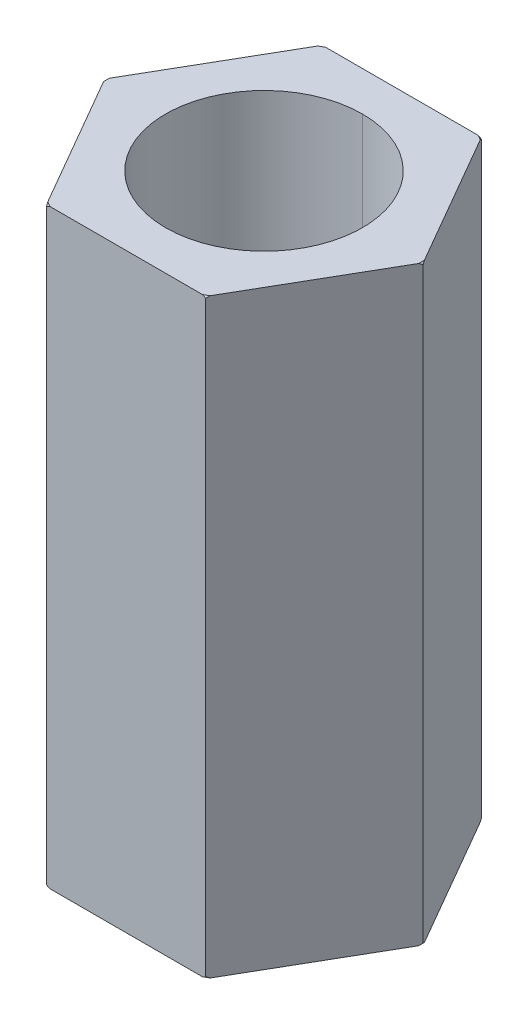
ISO-10303-21;
HEADER;
FILE_DESCRIPTION(('STEP AP214'),'2;1');
FILE_NAME('part.step','',(''),(''),'','','');
FILE_SCHEMA(('AUTOMOTIVE_DESIGN { 1 0 10303 214 1 1 1 1 }'));
ENDSEC;
DATA;
#1=APPLICATION_CONTEXT('core data for automotive mechanical design processes');
#2=APPLICATION_PROTOCOL_DEFINITION('international standard','automotive_design',2000,#1);
#3=PRODUCT_CONTEXT('',#1,'mechanical');
#4=PRODUCT('Part','Part','',(#3));
#5=PRODUCT_RELATED_PRODUCT_CATEGORY('part','',(#4));
#6=PRODUCT_DEFINITION_FORMATION('','',#4);
#7=PRODUCT_DEFINITION_CONTEXT('part definition',#1,'design');
#8=PRODUCT_DEFINITION('design','',#6,#7);
#9=PRODUCT_DEFINITION_SHAPE('','',#8);
#10=(LENGTH_UNIT() NAMED_UNIT(*) SI_UNIT(.MILLI.,.METRE.));
#11=(NAMED_UNIT(*) PLANE_ANGLE_UNIT() SI_UNIT($,.RADIAN.));
#12=(NAMED_UNIT(*) SI_UNIT($,.STERADIAN.) SOLID_ANGLE_UNIT());
#13=UNCERTAINTY_MEASURE_WITH_UNIT(LENGTH_MEASURE(1.E-05),#10,'distance_accuracy_value','');
#14=(GEOMETRIC_REPRESENTATION_CONTEXT(3) GLOBAL_UNCERTAINTY_ASSIGNED_CONTEXT((#13)) GLOBAL_UNIT_ASSIGNED_CONTEXT((#10,
#11,#12)) REPRESENTATION_CONTEXT('',''));
#15=CARTESIAN_POINT('',(0.,0.,0.));
#16=DIRECTION('',(0.,0.,1.));
#17=DIRECTION('',(1.,0.,0.));
#18=AXIS2_PLACEMENT_3D('',#15,#16,#17);
#19=CARTESIAN_POINT('',(-154.451169057511,-7.90000000007917,3.18934404187436E-08));
#20=DIRECTION('',(0.866025407723111,0.,-0.499999993178019));
#21=DIRECTION('',(0.,-1.,0.));
#22=AXIS2_PLACEMENT_3D('',#19,#20,#21);
#23=PLANE('',#22);
#24=DIRECTION('',(-0.499999993178019,0.,-0.866025407723111));
#25=VECTOR('',#24,1.);
#26=CARTESIAN_POINT('',(-154.451169057511,-7.90000000007917,3.18934404187436E-08));
#27=LINE('',#26,#25);
#28=CARTESIAN_POINT('',(-154.493286191451,-7.9000000000633,-0.0729489852858785));
#29=VERTEX_POINT('',#28);
#30=CARTESIAN_POINT('',(-156.429777838165,-7.90000000007917,-3.42705096684511));
#31=VERTEX_POINT('',#30);
#32=EDGE_CURVE('E537',#29,#31,#27,.T.);
#33=ORIENTED_EDGE('',*,*,#32,.T.);
#34=CARTESIAN_POINT('',(-156.471894972104,-7.85854811574754,-3.49999998402448));
#35=CARTESIAN_POINT('',(-156.457884963536,-7.8725581245091,-3.4757339369268));
#36=CARTESIAN_POINT('',(-156.443846342278,-7.88637822934221,-3.45141833119845));
#37=CARTESIAN_POINT('',(-156.429777838165,-7.90000000007917,-3.42705096684511));
#38=(BOUNDED_CURVE() B_SPLINE_CURVE(3,(#34,#35,#36,#37),.UNSPECIFIED.,.F.,
.F.) B_SPLINE_CURVE_WITH_KNOTS((4,4),(8.90538928710057E-07,9.35024040561138E-05),
.UNSPECIFIED.) CURVE() GEOMETRIC_REPRESENTATION_ITEM() RATIONAL_B_SPLINE_CURVE((1.,1.,1.,1.)) REPRESENTATION_ITEM(''));
#39=CARTESIAN_POINT('',(-156.471894972104,-7.85854811574754,-3.49999998402448));
#40=VERTEX_POINT('',#39);
#41=EDGE_CURVE('E341',#40,#31,#38,.T.);
#42=ORIENTED_EDGE('',*,*,#41,.F.);
#43=DIRECTION('',(0.,1.,0.));
#44=VECTOR('',#43,1.);
#45=CARTESIAN_POINT('',(-156.471894972104,-7.90000000007917,-3.49999998402448));
#46=LINE('',#45,#44);
#47=CARTESIAN_POINT('',(-156.471894972104,7.05854811567171,-3.49999998402447));
#48=VERTEX_POINT('',#47);
#49=EDGE_CURVE('E10',#40,#48,#46,.T.);
#50=ORIENTED_EDGE('',*,*,#49,.T.);
#51=CARTESIAN_POINT('',(-156.429777838165,7.0999999999799,-3.4270509668451));
#52=CARTESIAN_POINT('',(-156.443856137951,7.08636874464178,-3.45143529780168));
#53=CARTESIAN_POINT('',(-156.457894565006,7.07254852296098,-3.47575056716213));
#54=CARTESIAN_POINT('',(-156.471894972104,7.05854811567171,-3.49999998402447));
#55=(BOUNDED_CURVE() B_SPLINE_CURVE(3,(#51,#52,#53,#54),.UNSPECIFIED.,.F.,
.F.) B_SPLINE_CURVE_WITH_KNOTS((4,4),(0.00200542437731116,0.00209830438009965),
.UNSPECIFIED.) CURVE() GEOMETRIC_REPRESENTATION_ITEM() RATIONAL_B_SPLINE_CURVE((1.,1.,1.,1.)) REPRESENTATION_ITEM(''));
#56=CARTESIAN_POINT('',(-156.429777838165,7.0999999999799,-3.4270509668451));
#57=VERTEX_POINT('',#56);
#58=EDGE_CURVE('E395',#57,#48,#55,.T.);
#59=ORIENTED_EDGE('',*,*,#58,.F.);
#60=DIRECTION('',(-0.499999993178019,0.,-0.866025407723111));
#61=VECTOR('',#60,1.);
#62=CARTESIAN_POINT('',(-155.461532014808,7.10000000000034,-1.74999997606549));
#63=LINE('',#62,#61);
#64=CARTESIAN_POINT('',(-154.493286191451,7.10000000000034,-0.0729489852858814));
#65=VERTEX_POINT('',#64);
#66=EDGE_CURVE('E47',#65,#57,#63,.T.);
#67=ORIENTED_EDGE('',*,*,#66,.F.);
#68=CARTESIAN_POINT('',(-154.451169057511,7.05854811567173,3.1893443186631E-08));
#69=CARTESIAN_POINT('',(-154.465179066081,7.07255812443095,-0.0242660152045795));
#70=CARTESIAN_POINT('',(-154.479217687338,7.08637822926172,-0.0485816209332638));
#71=CARTESIAN_POINT('',(-154.493286191451,7.10000000000034,-0.0729489852858814));
#72=(BOUNDED_CURVE() B_SPLINE_CURVE(3,(#68,#69,#70,#71),.UNSPECIFIED.,.F.,
.F.) B_SPLINE_CURVE_WITH_KNOTS((4,4),(8.90538928679352E-07,9.35024040539287E-05),
.UNSPECIFIED.) CURVE() GEOMETRIC_REPRESENTATION_ITEM() RATIONAL_B_SPLINE_CURVE((1.,1.,1.,1.)) REPRESENTATION_ITEM(''));
#73=CARTESIAN_POINT('',(-154.451169057511,7.05854811567173,3.1893443186631E-08));
#74=VERTEX_POINT('',#73);
#75=EDGE_CURVE('E504',#74,#65,#72,.T.);
#76=ORIENTED_EDGE('',*,*,#75,.F.);
#77=DIRECTION('',(0.,1.,0.));
#78=VECTOR('',#77,1.);
#79=CARTESIAN_POINT('',(-154.451169057511,-7.90000000007917,3.18934404187436E-08));
#80=LINE('',#79,#78);
#81=CARTESIAN_POINT('',(-154.451169057511,-7.85854811574756,3.18934404264137E-08));
#82=VERTEX_POINT('',#81);
#83=EDGE_CURVE('E37',#82,#74,#80,.T.);
#84=ORIENTED_EDGE('',*,*,#83,.F.);
#85=CARTESIAN_POINT('',(-154.493286191451,-7.9000000000633,-0.0729489852858785));
#86=CARTESIAN_POINT('',(-154.479210408788,-7.88637118191619,-0.0485690141136089));
#87=CARTESIAN_POINT('',(-154.465171929299,-7.8725509877266,-0.0242536539342294));
#88=CARTESIAN_POINT('',(-154.451169057511,-7.85854811574756,3.18934404264137E-08));
#89=(BOUNDED_CURVE() B_SPLINE_CURVE(3,(#85,#86,#87,#88),.UNSPECIFIED.,.F.,
.F.) B_SPLINE_CURVE_WITH_KNOTS((4,4),(0.00206716359408731,0.00216043693066559),
.UNSPECIFIED.) CURVE() GEOMETRIC_REPRESENTATION_ITEM() RATIONAL_B_SPLINE_CURVE((1.,1.,1.,1.)) REPRESENTATION_ITEM(''));
#90=EDGE_CURVE('E351',#29,#82,#89,.T.);
#91=ORIENTED_EDGE('',*,*,#90,.F.);
#92=EDGE_LOOP('',(#33,#42,#50,#59,#67,#76,#84,#91));
#93=FACE_BOUND('',#92,.T.);
#94=ADVANCED_FACE('F16',(#93),#23,.T.);
#95=CARTESIAN_POINT('',(-156.471894972104,-7.90000000007917,-3.49999998402448));
#96=DIRECTION('',(7.87733906095199E-09,0.,-1.));
#97=DIRECTION('',(0.,-1.,0.));
#98=AXIS2_PLACEMENT_3D('',#95,#96,#97);
#99=PLANE('',#98);
#100=DIRECTION('',(0.,1.,0.));
#101=VECTOR('',#100,1.);
#102=CARTESIAN_POINT('',(-160.513346856432,-7.90000000007917,-3.50000001586036));
#103=LINE('',#102,#101);
#104=CARTESIAN_POINT('',(-160.513346856432,-7.85854811574755,-3.50000001586036));
#105=VERTEX_POINT('',#104);
#106=CARTESIAN_POINT('',(-160.513346856432,7.05854811567171,-3.50000001586036));
#107=VERTEX_POINT('',#106);
#108=EDGE_CURVE('E24',#105,#107,#103,.T.);
#109=ORIENTED_EDGE('',*,*,#108,.T.);
#110=CARTESIAN_POINT('',(-160.429112587404,7.10000000000034,-3.50000001519682));
#111=CARTESIAN_POINT('',(-160.457269187895,7.08636874438265,-3.50000001541862));
#112=CARTESIAN_POINT('',(-160.485346042379,7.07254852269762,-3.50000001563979));
#113=CARTESIAN_POINT('',(-160.513346856432,7.05854811567171,-3.50000001586036));
#114=(BOUNDED_CURVE() B_SPLINE_CURVE(3,(#110,#111,#112,#113),.UNSPECIFIED.,.F.,
.F.) B_SPLINE_CURVE_WITH_KNOTS((4,4),(0.00200531664897424,0.00209819653849958),
.UNSPECIFIED.) CURVE() GEOMETRIC_REPRESENTATION_ITEM() RATIONAL_B_SPLINE_CURVE((1.,1.,1.,1.)) REPRESENTATION_ITEM(''));
#115=CARTESIAN_POINT('',(-160.429112587404,7.10000000000034,-3.50000001519682));
#116=VERTEX_POINT('',#115);
#117=EDGE_CURVE('E352',#116,#107,#114,.T.);
#118=ORIENTED_EDGE('',*,*,#117,.F.);
#119=DIRECTION('',(-1.,0.,-7.87733906095199E-09));
#120=VECTOR('',#119,1.);
#121=CARTESIAN_POINT('',(-158.492620914268,7.10000000000034,-3.49999999994241));
#122=LINE('',#121,#120);
#123=CARTESIAN_POINT('',(-156.556129241133,7.10000000000034,-3.49999998468801));
#124=VERTEX_POINT('',#123);
#125=EDGE_CURVE('E481',#124,#116,#122,.T.);
#126=ORIENTED_EDGE('',*,*,#125,.F.);
#127=CARTESIAN_POINT('',(-156.471894972104,7.05854811567171,-3.49999998402447));
#128=CARTESIAN_POINT('',(-156.499914992089,7.07255812566235,-3.49999998424519));
#129=CARTESIAN_POINT('',(-156.527992235033,7.08637823047646,-3.49999998446637));
#130=CARTESIAN_POINT('',(-156.556129241133,7.10000000000034,-3.49999998468801));
#131=(BOUNDED_CURVE() B_SPLINE_CURVE(3,(#127,#128,#129,#130),.UNSPECIFIED.,.F.,
.F.) B_SPLINE_CURVE_WITH_KNOTS((4,4),(7.71225514155726E-07,9.33828832193013E-05),
.UNSPECIFIED.) CURVE() GEOMETRIC_REPRESENTATION_ITEM() RATIONAL_B_SPLINE_CURVE((1.,1.,1.,1.)) REPRESENTATION_ITEM(''));
#132=EDGE_CURVE('E404',#48,#124,#131,.T.);
#133=ORIENTED_EDGE('',*,*,#132,.F.);
#134=ORIENTED_EDGE('',*,*,#49,.F.);
#135=CARTESIAN_POINT('',(-156.556129241133,-7.90000000007917,-3.49999998468802));
#136=CARTESIAN_POINT('',(-156.527972640642,-7.88636874446331,-3.49999998446622));
#137=CARTESIAN_POINT('',(-156.499895786158,-7.87254852277602,-3.49999998424504));
#138=CARTESIAN_POINT('',(-156.471894972104,-7.85854811574754,-3.49999998402448));
#139=(BOUNDED_CURVE() B_SPLINE_CURVE(3,(#135,#136,#137,#138),.UNSPECIFIED.,.F.,
.F.) B_SPLINE_CURVE_WITH_KNOTS((4,4),(0.00200531667631435,0.00209819656584083),
.UNSPECIFIED.) CURVE() GEOMETRIC_REPRESENTATION_ITEM() RATIONAL_B_SPLINE_CURVE((1.,1.,1.,1.)) REPRESENTATION_ITEM(''));
#140=CARTESIAN_POINT('',(-156.556129241133,-7.90000000007917,-3.49999998468802));
#141=VERTEX_POINT('',#140);
#142=EDGE_CURVE('E332',#141,#40,#139,.T.);
#143=ORIENTED_EDGE('',*,*,#142,.F.);
#144=DIRECTION('',(-1.,0.,-7.87733906095199E-09));
#145=VECTOR('',#144,1.);
#146=CARTESIAN_POINT('',(-156.471894972104,-7.90000000007917,-3.49999998402448));
#147=LINE('',#146,#145);
#148=CARTESIAN_POINT('',(-160.429112587404,-7.90000000007918,-3.50000001519682));
#149=VERTEX_POINT('',#148);
#150=EDGE_CURVE('E531',#141,#149,#147,.T.);
#151=ORIENTED_EDGE('',*,*,#150,.T.);
#152=CARTESIAN_POINT('',(-160.513346856432,-7.85854811574755,-3.50000001586036));
#153=CARTESIAN_POINT('',(-160.485326836449,-7.87255812574054,-3.50000001563963));
#154=CARTESIAN_POINT('',(-160.457249593505,-7.88637823055697,-3.50000001541847));
#155=CARTESIAN_POINT('',(-160.429112587404,-7.90000000007918,-3.50000001519682));
#156=(BOUNDED_CURVE() B_SPLINE_CURVE(3,(#152,#153,#154,#155),.UNSPECIFIED.,.F.,
.F.) B_SPLINE_CURVE_WITH_KNOTS((4,4),(7.71225514202071E-07,9.33828832214226E-05),
.UNSPECIFIED.) CURVE() GEOMETRIC_REPRESENTATION_ITEM() RATIONAL_B_SPLINE_CURVE((1.,1.,1.,1.)) REPRESENTATION_ITEM(''));
#157=EDGE_CURVE('E302',#105,#149,#156,.T.);
#158=ORIENTED_EDGE('',*,*,#157,.F.);
#159=EDGE_LOOP('',(#109,#118,#126,#133,#134,#143,#151,#158));
#160=FACE_BOUND('',#159,.T.);
#161=ADVANCED_FACE('F561',(#160),#99,.T.);
#162=CARTESIAN_POINT('',(-160.513346856432,-7.90000000007917,-3.50000001586036));
#163=DIRECTION('',(-0.866025399845771,0.,-0.500000006821972));
#164=DIRECTION('',(-0.500000006821972,0.,0.866025399845771));
#165=AXIS2_PLACEMENT_3D('',#162,#163,#164);
#166=PLANE('',#165);
#167=DIRECTION('',(-0.500000006821972,0.,0.866025399845771));
#168=VECTOR('',#167,1.);
#169=CARTESIAN_POINT('',(-160.513346856432,-7.90000000007917,-3.50000001586036));
#170=LINE('',#169,#168);
#171=CARTESIAN_POINT('',(-160.555463991521,-7.90000000007917,-3.42705099934455));
#172=VERTEX_POINT('',#171);
#173=CARTESIAN_POINT('',(-162.491955691085,-7.90000000007918,-0.0729490482809071));
#174=VERTEX_POINT('',#173);
#175=EDGE_CURVE('E524',#172,#174,#170,.T.);
#176=ORIENTED_EDGE('',*,*,#175,.T.);
#177=CARTESIAN_POINT('',(-162.534072826167,-7.8585481156981,-3.17783206154693E-08));
#178=CARTESIAN_POINT('',(-162.520062817215,-7.87255812445961,-0.0242660786551696));
#179=CARTESIAN_POINT('',(-162.506024195574,-7.88637822929266,-0.0485816841622434));
#180=CARTESIAN_POINT('',(-162.491955691085,-7.90000000007918,-0.0729490482809071));
#181=(BOUNDED_CURVE() B_SPLINE_CURVE(3,(#177,#178,#179,#180),.UNSPECIFIED.,.F.,
.F.) B_SPLINE_CURVE_WITH_KNOTS((4,4),(8.90538936818046E-07,9.35024040638618E-05),
.UNSPECIFIED.) CURVE() GEOMETRIC_REPRESENTATION_ITEM() RATIONAL_B_SPLINE_CURVE((1.,1.,1.,1.)) REPRESENTATION_ITEM(''));
#182=CARTESIAN_POINT('',(-162.534072826167,-7.8585481156981,-3.17783206154693E-08));
#183=VERTEX_POINT('',#182);
#184=EDGE_CURVE('E259',#183,#174,#181,.T.);
#185=ORIENTED_EDGE('',*,*,#184,.F.);
#186=DIRECTION('',(0.,1.,0.));
#187=VECTOR('',#186,1.);
#188=CARTESIAN_POINT('',(-162.534072826167,-7.90000000007918,-3.17783206231394E-08));
#189=LINE('',#188,#187);
#190=CARTESIAN_POINT('',(-162.534072826167,7.05854811578901,-3.17783178552521E-08));
#191=VERTEX_POINT('',#190);
#192=EDGE_CURVE('E488',#183,#191,#189,.T.);
#193=ORIENTED_EDGE('',*,*,#192,.T.);
#194=CARTESIAN_POINT('',(-162.491955691085,7.10000000000034,-0.0729490482809145));
#195=CARTESIAN_POINT('',(-162.506031474141,7.08637118193963,-0.0485690773163528));
#196=CARTESIAN_POINT('',(-162.520069954005,7.07255098775869,-0.0242537173713759));
#197=CARTESIAN_POINT('',(-162.534072826167,7.05854811578901,-3.17783178552521E-08));
#198=(BOUNDED_CURVE() B_SPLINE_CURVE(3,(#194,#195,#196,#197),.UNSPECIFIED.,.F.,
.F.) B_SPLINE_CURVE_WITH_KNOTS((4,4),(0.00206716353747514,0.0021604368739946),
.UNSPECIFIED.) CURVE() GEOMETRIC_REPRESENTATION_ITEM() RATIONAL_B_SPLINE_CURVE((1.,1.,1.,1.)) REPRESENTATION_ITEM(''));
#199=CARTESIAN_POINT('',(-162.491955691085,7.10000000000034,-0.0729490482809145));
#200=VERTEX_POINT('',#199);
#201=EDGE_CURVE('E442',#200,#191,#198,.T.);
#202=ORIENTED_EDGE('',*,*,#201,.F.);
#203=DIRECTION('',(-0.500000006821972,0.,0.866025399845771));
#204=VECTOR('',#203,1.);
#205=CARTESIAN_POINT('',(-161.523709841299,7.10000000000034,-1.75000002381933));
#206=LINE('',#205,#204);
#207=CARTESIAN_POINT('',(-160.555463991521,7.10000000000034,-3.42705099934456));
#208=VERTEX_POINT('',#207);
#209=EDGE_CURVE('E528',#208,#200,#206,.T.);
#210=ORIENTED_EDGE('',*,*,#209,.F.);
#211=CARTESIAN_POINT('',(-160.513346856432,7.05854811567171,-3.50000001586036));
#212=CARTESIAN_POINT('',(-160.527356865383,7.07255812443093,-3.47573396898305));
#213=CARTESIAN_POINT('',(-160.541395487025,7.08637822926169,-3.45141836347554));
#214=CARTESIAN_POINT('',(-160.555463991521,7.10000000000034,-3.42705099934456));
#215=(BOUNDED_CURVE() B_SPLINE_CURVE(3,(#211,#212,#213,#214),.UNSPECIFIED.,.F.,
.F.) B_SPLINE_CURVE_WITH_KNOTS((4,4),(8.90538936789053E-07,9.35024040620685E-05),
.UNSPECIFIED.) CURVE() GEOMETRIC_REPRESENTATION_ITEM() RATIONAL_B_SPLINE_CURVE((1.,1.,1.,1.)) REPRESENTATION_ITEM(''));
#216=EDGE_CURVE('E361',#107,#208,#215,.T.);
#217=ORIENTED_EDGE('',*,*,#216,.F.);
#218=ORIENTED_EDGE('',*,*,#108,.F.);
#219=CARTESIAN_POINT('',(-160.555463991521,-7.90000000007917,-3.42705099934455));
#220=CARTESIAN_POINT('',(-160.541385691353,-7.8863687447245,-3.45143533007615));
#221=CARTESIAN_POINT('',(-160.527347263914,-7.87254852304028,-3.47575059921702));
#222=CARTESIAN_POINT('',(-160.513346856432,-7.85854811574755,-3.50000001586036));
#223=(BOUNDED_CURVE() B_SPLINE_CURVE(3,(#219,#220,#221,#222),.UNSPECIFIED.,.F.,
.F.) B_SPLINE_CURVE_WITH_KNOTS((4,4),(0.00200542437733993,0.00209830438013784),
.UNSPECIFIED.) CURVE() GEOMETRIC_REPRESENTATION_ITEM() RATIONAL_B_SPLINE_CURVE((1.,1.,1.,1.)) REPRESENTATION_ITEM(''));
#224=EDGE_CURVE('E292',#172,#105,#223,.T.);
#225=ORIENTED_EDGE('',*,*,#224,.F.);
#226=EDGE_LOOP('',(#176,#185,#193,#202,#210,#217,#218,#225));
#227=FACE_BOUND('',#226,.T.);
#228=ADVANCED_FACE('F564',(#227),#166,.T.);
#229=CARTESIAN_POINT('',(-162.534072826167,-7.90000000007918,-3.17783206231394E-08));
#230=DIRECTION('',(-0.866025407723108,0.,0.499999993178024));
#231=DIRECTION('',(0.,1.,0.));
#232=AXIS2_PLACEMENT_3D('',#229,#230,#231);
#233=PLANE('',#232);
#234=DIRECTION('',(0.499999993178024,0.,0.866025407723108));
#235=VECTOR('',#234,1.);
#236=CARTESIAN_POINT('',(-162.534072826167,-7.90000000007918,-3.17783206231394E-08));
#237=LINE('',#236,#235);
#238=CARTESIAN_POINT('',(-162.491955692234,-7.90000000007918,0.0729489853877965));
#239=VERTEX_POINT('',#238);
#240=CARTESIAN_POINT('',(-160.555464045513,-7.90000000007918,3.4270509669603));
#241=VERTEX_POINT('',#240);
#242=EDGE_CURVE('E521',#239,#241,#237,.T.);
#243=ORIENTED_EDGE('',*,*,#242,.T.);
#244=CARTESIAN_POINT('',(-160.513346911573,-7.85854811574756,3.49999998413964));
#245=CARTESIAN_POINT('',(-160.527356920142,-7.87255812450913,3.47573393704198));
#246=CARTESIAN_POINT('',(-160.5413955414,-7.88637822934222,3.45141833131363));
#247=CARTESIAN_POINT('',(-160.555464045513,-7.90000000007918,3.4270509669603));
#248=(BOUNDED_CURVE() B_SPLINE_CURVE(3,(#244,#245,#246,#247),.UNSPECIFIED.,.F.,
.F.) B_SPLINE_CURVE_WITH_KNOTS((4,4),(8.90538928711855E-07,9.35024040560965E-05),
.UNSPECIFIED.) CURVE() GEOMETRIC_REPRESENTATION_ITEM() RATIONAL_B_SPLINE_CURVE((1.,1.,1.,1.)) REPRESENTATION_ITEM(''));
#249=CARTESIAN_POINT('',(-160.513346911573,-7.85854811574756,3.49999998413964));
#250=VERTEX_POINT('',#249);
#251=EDGE_CURVE('E244',#250,#241,#248,.T.);
#252=ORIENTED_EDGE('',*,*,#251,.F.);
#253=DIRECTION('',(0.,1.,0.));
#254=VECTOR('',#253,1.);
#255=CARTESIAN_POINT('',(-160.513346911573,-7.90000000007918,3.49999998413964));
#256=LINE('',#255,#254);
#257=CARTESIAN_POINT('',(-160.513346911573,7.05854811567172,3.49999998413964));
#258=VERTEX_POINT('',#257);
#259=EDGE_CURVE('E494',#250,#258,#256,.T.);
#260=ORIENTED_EDGE('',*,*,#259,.T.);
#261=CARTESIAN_POINT('',(-160.555464045513,7.10000000000034,3.42705096696027));
#262=CARTESIAN_POINT('',(-160.54138574573,7.08636874464412,3.45143529791273));
#263=CARTESIAN_POINT('',(-160.527347318673,7.07254852296218,3.47575056727524));
#264=CARTESIAN_POINT('',(-160.513346911573,7.05854811567172,3.49999998413964));
#265=(BOUNDED_CURVE() B_SPLINE_CURVE(3,(#261,#262,#263,#264),.UNSPECIFIED.,.F.,
.F.) B_SPLINE_CURVE_WITH_KNOTS((4,4),(0.0020054243773033,0.00209830438009966),
.UNSPECIFIED.) CURVE() GEOMETRIC_REPRESENTATION_ITEM() RATIONAL_B_SPLINE_CURVE((1.,1.,1.,1.)) REPRESENTATION_ITEM(''));
#266=CARTESIAN_POINT('',(-160.555464045513,7.10000000000034,3.42705096696027));
#267=VERTEX_POINT('',#266);
#268=EDGE_CURVE('E428',#267,#258,#265,.T.);
#269=ORIENTED_EDGE('',*,*,#268,.F.);
#270=DIRECTION('',(0.499999993178024,0.,0.866025407723108));
#271=VECTOR('',#270,1.);
#272=CARTESIAN_POINT('',(-161.52370986887,7.10000000000034,1.74999997618065));
#273=LINE('',#272,#271);
#274=CARTESIAN_POINT('',(-162.491955692234,7.10000000000034,0.0729489853878461));
#275=VERTEX_POINT('',#274);
#276=EDGE_CURVE('E525',#275,#267,#273,.T.);
#277=ORIENTED_EDGE('',*,*,#276,.F.);
#278=CARTESIAN_POINT('',(-162.534072826167,7.05854811578901,-3.17783178552521E-08));
#279=CARTESIAN_POINT('',(-162.520062817604,7.07255812454202,0.0242660153067459));
#280=CARTESIAN_POINT('',(-162.506024196355,7.08637822936676,0.0485816210224043));
#281=CARTESIAN_POINT('',(-162.491955692234,7.10000000000034,0.0729489853878461));
#282=(BOUNDED_CURVE() B_SPLINE_CURVE(3,(#278,#279,#280,#281),.UNSPECIFIED.,.F.,
.F.) B_SPLINE_CURVE_WITH_KNOTS((4,4),(8.90538928726498E-07,9.35024040062036E-05),
.UNSPECIFIED.) CURVE() GEOMETRIC_REPRESENTATION_ITEM() RATIONAL_B_SPLINE_CURVE((1.,1.,1.,1.)) REPRESENTATION_ITEM(''));
#283=EDGE_CURVE('E429',#191,#275,#282,.T.);
#284=ORIENTED_EDGE('',*,*,#283,.F.);
#285=ORIENTED_EDGE('',*,*,#192,.F.);
#286=CARTESIAN_POINT('',(-162.491955692234,-7.90000000007918,0.0729489853877965));
#287=CARTESIAN_POINT('',(-162.506031474887,-7.8863711818698,0.0485690142341432));
#288=CARTESIAN_POINT('',(-162.520069954378,-7.87255098767883,0.0242536540522693));
#289=CARTESIAN_POINT('',(-162.534072826167,-7.8585481156981,-3.17783206154693E-08));
#290=(BOUNDED_CURVE() B_SPLINE_CURVE(3,(#286,#287,#288,#289),.UNSPECIFIED.,.F.,
.F.) B_SPLINE_CURVE_WITH_KNOTS((4,4),(0.00206716362406268,0.00216043696065402),
.UNSPECIFIED.) CURVE() GEOMETRIC_REPRESENTATION_ITEM() RATIONAL_B_SPLINE_CURVE((1.,1.,1.,1.)) REPRESENTATION_ITEM(''));
#291=EDGE_CURVE('E254',#239,#183,#290,.T.);
#292=ORIENTED_EDGE('',*,*,#291,.F.);
#293=EDGE_LOOP('',(#243,#252,#260,#269,#277,#284,#285,#292));
#294=FACE_BOUND('',#293,.T.);
#295=ADVANCED_FACE('F595',(#294),#233,.T.);
#296=CARTESIAN_POINT('',(-160.513346911573,-7.90000000007918,3.49999998413964));
#297=DIRECTION('',(-7.8773391682604E-09,0.,1.));
#298=DIRECTION('',(-2.34898067185813E-08,1.,0.));
#299=AXIS2_PLACEMENT_3D('',#296,#297,#298);
#300=PLANE('',#299);
#301=DIRECTION('',(1.,0.,7.87733916826039E-09));
#302=VECTOR('',#301,1.);
#303=CARTESIAN_POINT('',(-160.513346911573,-7.90000000007918,3.49999998413964));
#304=LINE('',#303,#302);
#305=CARTESIAN_POINT('',(-160.429112642545,-7.90000000007918,3.49999998480318));
#306=VERTEX_POINT('',#305);
#307=CARTESIAN_POINT('',(-156.556129296274,-7.90000000007918,3.50000001531199));
#308=VERTEX_POINT('',#307);
#309=EDGE_CURVE('E518',#306,#308,#304,.T.);
#310=ORIENTED_EDGE('',*,*,#309,.T.);
#311=CARTESIAN_POINT('',(-156.471895027246,-7.85854811574757,3.50000001597553));
#312=CARTESIAN_POINT('',(-156.499915047229,-7.87255812574055,3.50000001575481));
#313=CARTESIAN_POINT('',(-156.527992290174,-7.88637823055697,3.50000001553363));
#314=CARTESIAN_POINT('',(-156.556129296274,-7.90000000007918,3.50000001531199));
#315=(BOUNDED_CURVE() B_SPLINE_CURVE(3,(#311,#312,#313,#314),.UNSPECIFIED.,.F.,
.F.) B_SPLINE_CURVE_WITH_KNOTS((4,4),(7.71225514202071E-07,9.33828832213644E-05),
.UNSPECIFIED.) CURVE() GEOMETRIC_REPRESENTATION_ITEM() RATIONAL_B_SPLINE_CURVE((1.,1.,1.,1.)) REPRESENTATION_ITEM(''));
#316=CARTESIAN_POINT('',(-156.471895027246,-7.85854811574757,3.50000001597553));
#317=VERTEX_POINT('',#316);
#318=EDGE_CURVE('E331',#317,#308,#315,.T.);
#319=ORIENTED_EDGE('',*,*,#318,.F.);
#320=DIRECTION('',(0.,1.,0.));
#321=VECTOR('',#320,1.);
#322=CARTESIAN_POINT('',(-156.471895027246,-7.90000000007917,3.50000001597553));
#323=LINE('',#322,#321);
#324=CARTESIAN_POINT('',(-156.471895027246,7.05854811567173,3.50000001597553));
#325=VERTEX_POINT('',#324);
#326=EDGE_CURVE('E534',#317,#325,#323,.T.);
#327=ORIENTED_EDGE('',*,*,#326,.T.);
#328=CARTESIAN_POINT('',(-156.556129296274,7.10000000000034,3.50000001531199));
#329=CARTESIAN_POINT('',(-156.527972695783,7.08636874438266,3.50000001553379));
#330=CARTESIAN_POINT('',(-156.499895841299,7.07254852269763,3.50000001575496));
#331=CARTESIAN_POINT('',(-156.471895027246,7.05854811567173,3.50000001597553));
#332=(BOUNDED_CURVE() B_SPLINE_CURVE(3,(#328,#329,#330,#331),.UNSPECIFIED.,.F.,
.F.) B_SPLINE_CURVE_WITH_KNOTS((4,4),(0.00200531664897421,0.00209819653849952),
.UNSPECIFIED.) CURVE() GEOMETRIC_REPRESENTATION_ITEM() RATIONAL_B_SPLINE_CURVE((1.,1.,1.,1.)) REPRESENTATION_ITEM(''));
#333=CARTESIAN_POINT('',(-156.556129296274,7.10000000000034,3.50000001531199));
#334=VERTEX_POINT('',#333);
#335=EDGE_CURVE('E275',#334,#325,#332,.T.);
#336=ORIENTED_EDGE('',*,*,#335,.F.);
#337=DIRECTION('',(1.,0.,7.87733916826039E-09));
#338=VECTOR('',#337,1.);
#339=CARTESIAN_POINT('',(-158.49262096941,7.10000000000034,3.50000000005759));
#340=LINE('',#339,#338);
#341=CARTESIAN_POINT('',(-160.429112642545,7.10000000000034,3.49999998480319));
#342=VERTEX_POINT('',#341);
#343=EDGE_CURVE('E217',#342,#334,#340,.T.);
#344=ORIENTED_EDGE('',*,*,#343,.F.);
#345=CARTESIAN_POINT('',(-160.513346911573,7.05854811567172,3.49999998413964));
#346=CARTESIAN_POINT('',(-160.485326891589,7.07255812566235,3.49999998436037));
#347=CARTESIAN_POINT('',(-160.457249648645,7.08637823047645,3.49999998458154));
#348=CARTESIAN_POINT('',(-160.429112642545,7.10000000000034,3.49999998480319));
#349=(BOUNDED_CURVE() B_SPLINE_CURVE(3,(#345,#346,#347,#348),.UNSPECIFIED.,.F.,
.F.) B_SPLINE_CURVE_WITH_KNOTS((4,4),(7.71225514155726E-07,9.33828832192431E-05),
.UNSPECIFIED.) CURVE() GEOMETRIC_REPRESENTATION_ITEM() RATIONAL_B_SPLINE_CURVE((1.,1.,1.,1.)) REPRESENTATION_ITEM(''));
#350=EDGE_CURVE('E464',#258,#342,#349,.T.);
#351=ORIENTED_EDGE('',*,*,#350,.F.);
#352=ORIENTED_EDGE('',*,*,#259,.F.);
#353=CARTESIAN_POINT('',(-160.429112642545,-7.90000000007918,3.49999998480318));
#354=CARTESIAN_POINT('',(-160.457269243037,-7.88636874446331,3.49999998458139));
#355=CARTESIAN_POINT('',(-160.485346097521,-7.87254852277603,3.49999998436021));
#356=CARTESIAN_POINT('',(-160.513346911573,-7.85854811574756,3.49999998413964));
#357=(BOUNDED_CURVE() B_SPLINE_CURVE(3,(#353,#354,#355,#356),.UNSPECIFIED.,.F.,
.F.) B_SPLINE_CURVE_WITH_KNOTS((4,4),(0.00200531667631435,0.00209819656584077),
.UNSPECIFIED.) CURVE() GEOMETRIC_REPRESENTATION_ITEM() RATIONAL_B_SPLINE_CURVE((1.,1.,1.,1.)) REPRESENTATION_ITEM(''));
#358=EDGE_CURVE('E238',#306,#250,#357,.T.);
#359=ORIENTED_EDGE('',*,*,#358,.F.);
#360=EDGE_LOOP('',(#310,#319,#327,#336,#344,#351,#352,#359));
#361=FACE_BOUND('',#360,.T.);
#362=ADVANCED_FACE('F607',(#361),#300,.T.);
#363=CARTESIAN_POINT('',(-156.471895027246,-7.90000000007917,3.50000001597553));
#364=DIRECTION('',(0.866025399845768,0.,0.500000006821978));
#365=DIRECTION('',(0.,-1.,0.));
#366=AXIS2_PLACEMENT_3D('',#363,#364,#365);
#367=PLANE('',#366);
#368=DIRECTION('',(0.500000006821978,0.,-0.866025399845768));
#369=VECTOR('',#368,1.);
#370=CARTESIAN_POINT('',(-156.471895027246,-7.90000000007917,3.50000001597553));
#371=LINE('',#370,#369);
#372=CARTESIAN_POINT('',(-156.429777892158,-7.90000000007917,3.42705099945974));
#373=VERTEX_POINT('',#372);
#374=CARTESIAN_POINT('',(-154.4932861926,-7.90000000007917,0.0729490484092247));
#375=VERTEX_POINT('',#374);
#376=EDGE_CURVE('E512',#373,#375,#371,.T.);
#377=ORIENTED_EDGE('',*,*,#376,.T.);
#378=CARTESIAN_POINT('',(-154.451169057511,-7.85854811574756,3.18934404264137E-08));
#379=CARTESIAN_POINT('',(-154.465179066463,-7.87255812450913,0.0242660787703762));
#380=CARTESIAN_POINT('',(-154.479217688103,-7.88637822934222,0.04858168427754));
#381=CARTESIAN_POINT('',(-154.4932861926,-7.90000000007917,0.0729490484092247));
#382=(BOUNDED_CURVE() B_SPLINE_CURVE(3,(#378,#379,#380,#381),.UNSPECIFIED.,.F.,
.F.) B_SPLINE_CURVE_WITH_KNOTS((4,4),(8.90538936815882E-07,9.35024040641907E-05),
.UNSPECIFIED.) CURVE() GEOMETRIC_REPRESENTATION_ITEM() RATIONAL_B_SPLINE_CURVE((1.,1.,1.,1.)) REPRESENTATION_ITEM(''));
#383=EDGE_CURVE('E371',#82,#375,#382,.T.);
#384=ORIENTED_EDGE('',*,*,#383,.F.);
#385=ORIENTED_EDGE('',*,*,#83,.T.);
#386=CARTESIAN_POINT('',(-154.4932861926,7.10000000000034,0.0729490484092247));
#387=CARTESIAN_POINT('',(-154.479210409555,7.086371181837,0.0485690774617175));
#388=CARTESIAN_POINT('',(-154.465171929681,7.07255098764885,0.0242537175015936));
#389=CARTESIAN_POINT('',(-154.451169057511,7.05854811567173,3.1893443186631E-08));
#390=(BOUNDED_CURVE() B_SPLINE_CURVE(3,(#386,#387,#388,#389),.UNSPECIFIED.,.F.,
.F.) B_SPLINE_CURVE_WITH_KNOTS((4,4),(0.00206716353744985,0.00216043687402578),
.UNSPECIFIED.) CURVE() GEOMETRIC_REPRESENTATION_ITEM() RATIONAL_B_SPLINE_CURVE((1.,1.,1.,1.)) REPRESENTATION_ITEM(''));
#391=CARTESIAN_POINT('',(-154.4932861926,7.10000000000034,0.0729490484092247));
#392=VERTEX_POINT('',#391);
#393=EDGE_CURVE('E498',#392,#74,#390,.T.);
#394=ORIENTED_EDGE('',*,*,#393,.F.);
#395=DIRECTION('',(0.500000006821978,0.,-0.866025399845768));
#396=VECTOR('',#395,1.);
#397=CARTESIAN_POINT('',(-155.461532042379,7.10000000000034,1.75000002393447));
#398=LINE('',#397,#396);
#399=CARTESIAN_POINT('',(-156.429777892158,7.10000000000034,3.42705099945975));
#400=VERTEX_POINT('',#399);
#401=EDGE_CURVE('E482',#400,#392,#398,.T.);
#402=ORIENTED_EDGE('',*,*,#401,.F.);
#403=CARTESIAN_POINT('',(-156.471895027246,7.05854811567173,3.50000001597553));
#404=CARTESIAN_POINT('',(-156.457885018294,7.07255812443095,3.47573396909823));
#405=CARTESIAN_POINT('',(-156.443846396653,7.08637822926172,3.45141836359072));
#406=CARTESIAN_POINT('',(-156.429777892158,7.10000000000034,3.42705099945975));
#407=(BOUNDED_CURVE() B_SPLINE_CURVE(3,(#403,#404,#405,#406),.UNSPECIFIED.,.F.,
.F.) B_SPLINE_CURVE_WITH_KNOTS((4,4),(8.90538936782548E-07,9.35024040620444E-05),
.UNSPECIFIED.) CURVE() GEOMETRIC_REPRESENTATION_ITEM() RATIONAL_B_SPLINE_CURVE((1.,1.,1.,1.)) REPRESENTATION_ITEM(''));
#408=EDGE_CURVE('E284',#325,#400,#407,.T.);
#409=ORIENTED_EDGE('',*,*,#408,.F.);
#410=ORIENTED_EDGE('',*,*,#326,.F.);
#411=CARTESIAN_POINT('',(-156.429777892158,-7.90000000007917,3.42705099945974));
#412=CARTESIAN_POINT('',(-156.443856192326,-7.88636874472451,3.45143533019132));
#413=CARTESIAN_POINT('',(-156.457894619765,-7.87254852304029,3.4757505993322));
#414=CARTESIAN_POINT('',(-156.471895027246,-7.85854811574757,3.50000001597553));
#415=(BOUNDED_CURVE() B_SPLINE_CURVE(3,(#411,#412,#413,#414),.UNSPECIFIED.,.F.,
.F.) B_SPLINE_CURVE_WITH_KNOTS((4,4),(0.00200542437733999,0.00209830438013787),
.UNSPECIFIED.) CURVE() GEOMETRIC_REPRESENTATION_ITEM() RATIONAL_B_SPLINE_CURVE((1.,1.,1.,1.)) REPRESENTATION_ITEM(''));
#416=EDGE_CURVE('E297',#373,#317,#415,.T.);
#417=ORIENTED_EDGE('',*,*,#416,.F.);
#418=EDGE_LOOP('',(#377,#384,#385,#394,#402,#409,#410,#417));
#419=FACE_BOUND('',#418,.T.);
#420=ADVANCED_FACE('F613',(#419),#367,.T.);
#421=CARTESIAN_POINT('',(-158.492620941839,-7.89999999999966,5.75777315421994E-11));
#422=DIRECTION('',(0.,1.,0.));
#423=DIRECTION('',(0.,0.,1.));
#424=AXIS2_PLACEMENT_3D('',#421,#422,#423);
#425=CYLINDRICAL_SURFACE('',#424,2.5);
#426=DIRECTION('',(0.,1.,0.));
#427=VECTOR('',#426,1.);
#428=CARTESIAN_POINT('',(-158.492620941839,-7.89999999999966,-2.49999999994243));
#429=LINE('',#428,#427);
#430=CARTESIAN_POINT('',(-158.492620941839,-7.89999999999966,-2.49999999994243));
#431=VERTEX_POINT('',#430);
#432=CARTESIAN_POINT('',(-158.492620941839,7.10000000000034,-2.49999999994242));
#433=VERTEX_POINT('',#432);
#434=EDGE_CURVE('E210',#431,#433,#429,.T.);
#435=ORIENTED_EDGE('',*,*,#434,.F.);
#436=CARTESIAN_POINT('',(-158.492620941839,-7.89999999999966,5.75777315421994E-11));
#437=DIRECTION('',(0.,1.,0.));
#438=DIRECTION('',(0.,0.,1.));
#439=AXIS2_PLACEMENT_3D('',#436,#437,#438);
#440=CIRCLE('',#439,2.5);
#441=CARTESIAN_POINT('',(-158.492620941839,-7.89999999999966,2.50000000005758));
#442=VERTEX_POINT('',#441);
#443=EDGE_CURVE('E540',#442,#431,#440,.T.);
#444=ORIENTED_EDGE('',*,*,#443,.F.);
#445=DIRECTION('',(0.,1.,0.));
#446=VECTOR('',#445,1.);
#447=CARTESIAN_POINT('',(-158.492620941839,-7.89999999999966,2.50000000005758));
#448=LINE('',#447,#446);
#449=CARTESIAN_POINT('',(-158.492620941839,7.10000000000034,2.50000000005758));
#450=VERTEX_POINT('',#449);
#451=EDGE_CURVE('E213',#442,#450,#448,.T.);
#452=ORIENTED_EDGE('',*,*,#451,.T.);
#453=CARTESIAN_POINT('',(-158.492620941839,7.10000000000034,5.7580507099761E-11));
#454=DIRECTION('',(0.,-1.,0.));
#455=DIRECTION('',(0.,0.,1.));
#456=AXIS2_PLACEMENT_3D('',#453,#454,#455);
#457=CIRCLE('',#456,2.5);
#458=EDGE_CURVE('E206',#433,#450,#457,.T.);
#459=ORIENTED_EDGE('',*,*,#458,.F.);
#460=EDGE_LOOP('',(#435,#444,#452,#459));
#461=FACE_BOUND('',#460,.T.);
#462=ADVANCED_FACE('F208',(#461),#425,.F.);
#463=CARTESIAN_POINT('',(-158.492620941839,7.10000000000034,5.75714469554845E-11));
#464=DIRECTION('',(0.,1.,0.));
#465=DIRECTION('',(1.,0.,0.));
#466=AXIS2_PLACEMENT_3D('',#463,#464,#465);
#467=PLANE('',#466);
#468=CARTESIAN_POINT('',(-158.492620941839,7.10000000000034,5.7580507099761E-11));
#469=DIRECTION('',(0.,-1.,0.));
#470=DIRECTION('',(0.,0.,1.));
#471=AXIS2_PLACEMENT_3D('',#468,#469,#470);
#472=CIRCLE('',#471,2.5);
#473=EDGE_CURVE('E219',#450,#433,#472,.T.);
#474=ORIENTED_EDGE('',*,*,#473,.T.);
#475=ORIENTED_EDGE('',*,*,#458,.T.);
#476=EDGE_LOOP('',(#474,#475));
#477=FACE_BOUND('',#476,.T.);
#478=CARTESIAN_POINT('',(-158.492620941839,7.0999999999799,5.75806226341584E-11));
#479=DIRECTION('',(0.,1.,0.));
#480=DIRECTION('',(0.,0.,-1.));
#481=AXIS2_PLACEMENT_3D('',#478,#479,#480);
#482=CIRCLE('',#481,4.00000000001541);
#483=EDGE_CURVE('E413',#334,#400,#482,.T.);
#484=ORIENTED_EDGE('',*,*,#483,.T.);
#485=ORIENTED_EDGE('',*,*,#401,.T.);
#486=CARTESIAN_POINT('',(-158.492620941839,7.0999999999799,5.75806226341584E-11));
#487=DIRECTION('',(0.,1.,0.));
#488=DIRECTION('',(0.,0.,-1.));
#489=AXIS2_PLACEMENT_3D('',#486,#487,#488);
#490=CIRCLE('',#489,4.00000000001541);
#491=EDGE_CURVE('E420',#392,#65,#490,.T.);
#492=ORIENTED_EDGE('',*,*,#491,.T.);
#493=ORIENTED_EDGE('',*,*,#66,.T.);
#494=CARTESIAN_POINT('',(-158.492620941839,7.0999999999799,5.75806226341584E-11));
#495=DIRECTION('',(0.,1.,0.));
#496=DIRECTION('',(1.04083408558207E-13,0.,-1.));
#497=AXIS2_PLACEMENT_3D('',#494,#495,#496);
#498=CIRCLE('',#497,4.00000000001541);
#499=EDGE_CURVE('E362',#57,#124,#498,.T.);
#500=ORIENTED_EDGE('',*,*,#499,.T.);
#501=ORIENTED_EDGE('',*,*,#125,.T.);
#502=CARTESIAN_POINT('',(-158.492620941839,7.09999999997989,5.75806226341584E-11));
#503=DIRECTION('',(0.,1.,0.));
#504=DIRECTION('',(0.,0.,-1.));
#505=AXIS2_PLACEMENT_3D('',#502,#503,#504);
#506=CIRCLE('',#505,4.00000000001542);
#507=EDGE_CURVE('E435',#116,#208,#506,.T.);
#508=ORIENTED_EDGE('',*,*,#507,.T.);
#509=ORIENTED_EDGE('',*,*,#209,.T.);
#510=CARTESIAN_POINT('',(-158.492620941839,7.10000000009359,5.75805642302737E-11));
#511=DIRECTION('',(0.,1.,0.));
#512=DIRECTION('',(0.,0.,-1.));
#513=AXIS2_PLACEMENT_3D('',#510,#511,#512);
#514=CIRCLE('',#513,4.00000000002278);
#515=EDGE_CURVE('E424',#200,#275,#514,.T.);
#516=ORIENTED_EDGE('',*,*,#515,.T.);
#517=ORIENTED_EDGE('',*,*,#276,.T.);
#518=CARTESIAN_POINT('',(-158.492620941839,7.0999999999799,5.75806226341584E-11));
#519=DIRECTION('',(0.,1.,0.));
#520=DIRECTION('',(1.94289029308654E-13,0.,-1.));
#521=AXIS2_PLACEMENT_3D('',#518,#519,#520);
#522=CIRCLE('',#521,4.00000000001541);
#523=EDGE_CURVE('E285',#267,#342,#522,.T.);
#524=ORIENTED_EDGE('',*,*,#523,.T.);
#525=ORIENTED_EDGE('',*,*,#343,.T.);
#526=EDGE_LOOP('',(#484,#485,#492,#493,#500,#501,#508,#509,#516,#517,#524,#525));
#527=FACE_BOUND('',#526,.T.);
#528=ADVANCED_FACE('F220',(#477,#527),#467,.T.);
#529=CARTESIAN_POINT('',(-158.492620941839,-7.89999999999966,5.75686713979229E-11));
#530=DIRECTION('',(0.,1.,0.));
#531=DIRECTION('',(1.,0.,0.));
#532=AXIS2_PLACEMENT_3D('',#529,#530,#531);
#533=PLANE('',#532);
#534=ORIENTED_EDGE('',*,*,#443,.T.);
#535=CARTESIAN_POINT('',(-158.492620941839,-7.89999999999966,5.75777315421994E-11));
#536=DIRECTION('',(0.,1.,0.));
#537=DIRECTION('',(0.,0.,1.));
#538=AXIS2_PLACEMENT_3D('',#535,#536,#537);
#539=CIRCLE('',#538,2.5);
#540=EDGE_CURVE('E227',#431,#442,#539,.T.);
#541=ORIENTED_EDGE('',*,*,#540,.T.);
#542=EDGE_LOOP('',(#534,#541));
#543=FACE_BOUND('',#542,.T.);
#544=ORIENTED_EDGE('',*,*,#376,.F.);
#545=CARTESIAN_POINT('',(-158.492620941839,-7.9000000000633,5.75777854339891E-11));
#546=DIRECTION('',(0.,1.,0.));
#547=DIRECTION('',(-1.,0.,0.));
#548=AXIS2_PLACEMENT_3D('',#545,#546,#547);
#549=CIRCLE('',#548,4.00000000001541);
#550=EDGE_CURVE('E293',#308,#373,#549,.T.);
#551=ORIENTED_EDGE('',*,*,#550,.F.);
#552=ORIENTED_EDGE('',*,*,#309,.F.);
#553=CARTESIAN_POINT('',(-158.492620941839,-7.9000000000633,5.75777854339891E-11));
#554=DIRECTION('',(0.,1.,0.));
#555=DIRECTION('',(-1.,0.,0.));
#556=AXIS2_PLACEMENT_3D('',#553,#554,#555);
#557=CIRCLE('',#556,4.00000000001541);
#558=EDGE_CURVE('E245',#241,#306,#557,.T.);
#559=ORIENTED_EDGE('',*,*,#558,.F.);
#560=ORIENTED_EDGE('',*,*,#242,.F.);
#561=CARTESIAN_POINT('',(-158.492620941839,-7.90000000000645,5.75777854339891E-11));
#562=DIRECTION('',(0.,1.,0.));
#563=DIRECTION('',(-1.,0.,0.));
#564=AXIS2_PLACEMENT_3D('',#561,#562,#563);
#565=CIRCLE('',#564,4.00000000002279);
#566=CARTESIAN_POINT('',(-162.492620941862,-7.90000000000646,5.75777893463076E-11));
#567=VERTEX_POINT('',#566);
#568=EDGE_CURVE('E274',#567,#239,#565,.T.);
#569=ORIENTED_EDGE('',*,*,#568,.F.);
#570=CARTESIAN_POINT('',(-158.492620941839,-7.90000000000645,5.75777854339891E-11));
#571=DIRECTION('',(0.,1.,0.));
#572=DIRECTION('',(-1.,0.,0.));
#573=AXIS2_PLACEMENT_3D('',#570,#571,#572);
#574=CIRCLE('',#573,4.00000000002279);
#575=EDGE_CURVE('E236',#174,#567,#574,.T.);
#576=ORIENTED_EDGE('',*,*,#575,.F.);
#577=ORIENTED_EDGE('',*,*,#175,.F.);
#578=CARTESIAN_POINT('',(-158.492620941839,-7.9000000000633,5.75777854339891E-11));
#579=DIRECTION('',(0.,1.,0.));
#580=DIRECTION('',(-1.,0.,0.));
#581=AXIS2_PLACEMENT_3D('',#578,#579,#580);
#582=CIRCLE('',#581,4.00000000001541);
#583=EDGE_CURVE('E265',#149,#172,#582,.T.);
#584=ORIENTED_EDGE('',*,*,#583,.F.);
#585=ORIENTED_EDGE('',*,*,#150,.F.);
#586=CARTESIAN_POINT('',(-158.492620941839,-7.9000000000633,5.75777854339891E-11));
#587=DIRECTION('',(0.,1.,0.));
#588=DIRECTION('',(-1.,0.,0.));
#589=AXIS2_PLACEMENT_3D('',#586,#587,#588);
#590=CIRCLE('',#589,4.00000000001541);
#591=EDGE_CURVE('E342',#31,#141,#590,.T.);
#592=ORIENTED_EDGE('',*,*,#591,.F.);
#593=ORIENTED_EDGE('',*,*,#32,.F.);
#594=CARTESIAN_POINT('',(-158.492620941839,-7.9000000000633,5.75777854339891E-11));
#595=DIRECTION('',(0.,1.,0.));
#596=DIRECTION('',(-1.,0.,0.));
#597=AXIS2_PLACEMENT_3D('',#594,#595,#596);
#598=CIRCLE('',#597,4.00000000001541);
#599=EDGE_CURVE('E380',#375,#29,#598,.T.);
#600=ORIENTED_EDGE('',*,*,#599,.F.);
#601=EDGE_LOOP('',(#544,#551,#552,#559,#560,#569,#576,#577,#584,#585,#592,#593,#600));
#602=FACE_BOUND('',#601,.T.);
#603=ADVANCED_FACE('F584',(#543,#602),#533,.F.);
#604=CARTESIAN_POINT('',(-158.492620941839,6.47748503359935,5.75804474225041E-11));
#605=DIRECTION('',(0.,-1.,0.));
#606=DIRECTION('',(0.,0.,-1.));
#607=AXIS2_PLACEMENT_3D('',#604,#605,#606);
#608=CONICAL_SURFACE('',#607,4.6225149664528,0.785398163443104);
#609=ORIENTED_EDGE('',*,*,#491,.F.);
#610=ORIENTED_EDGE('',*,*,#393,.T.);
#611=ORIENTED_EDGE('',*,*,#75,.T.);
#612=EDGE_LOOP('',(#609,#610,#611));
#613=FACE_BOUND('',#612,.T.);
#614=ADVANCED_FACE('F618',(#613),#608,.T.);
#615=CARTESIAN_POINT('',(-158.492620941839,6.47748503359935,5.75804474225041E-11));
#616=DIRECTION('',(0.,-1.,0.));
#617=DIRECTION('',(0.,0.,-1.));
#618=AXIS2_PLACEMENT_3D('',#615,#616,#617);
#619=CONICAL_SURFACE('',#618,4.6225149664528,0.785398163443104);
#620=ORIENTED_EDGE('',*,*,#335,.T.);
#621=ORIENTED_EDGE('',*,*,#408,.T.);
#622=ORIENTED_EDGE('',*,*,#483,.F.);
#623=EDGE_LOOP('',(#620,#621,#622));
#624=FACE_BOUND('',#623,.T.);
#625=ADVANCED_FACE('F611',(#624),#619,.T.);
#626=CARTESIAN_POINT('',(-158.492620941839,6.47748503359935,5.75804474225041E-11));
#627=DIRECTION('',(0.,-1.,0.));
#628=DIRECTION('',(0.,0.,-1.));
#629=AXIS2_PLACEMENT_3D('',#626,#627,#628);
#630=CONICAL_SURFACE('',#629,4.6225149664528,0.785398163443104);
#631=ORIENTED_EDGE('',*,*,#268,.T.);
#632=ORIENTED_EDGE('',*,*,#350,.T.);
#633=ORIENTED_EDGE('',*,*,#523,.F.);
#634=EDGE_LOOP('',(#631,#632,#633));
#635=FACE_BOUND('',#634,.T.);
#636=ADVANCED_FACE('F603',(#635),#630,.T.);
#637=CARTESIAN_POINT('',(-158.492620941839,6.47748503359935,5.75804474225041E-11));
#638=DIRECTION('',(0.,-1.,0.));
#639=DIRECTION('',(0.,0.,-1.));
#640=AXIS2_PLACEMENT_3D('',#637,#638,#639);
#641=CONICAL_SURFACE('',#640,4.62251496651703,0.785398163397448);
#642=ORIENTED_EDGE('',*,*,#201,.T.);
#643=ORIENTED_EDGE('',*,*,#283,.T.);
#644=ORIENTED_EDGE('',*,*,#515,.F.);
#645=EDGE_LOOP('',(#642,#643,#644));
#646=FACE_BOUND('',#645,.T.);
#647=ADVANCED_FACE('F599',(#646),#641,.T.);
#648=CARTESIAN_POINT('',(-158.492620941839,6.47748503359935,5.75804474225041E-11));
#649=DIRECTION('',(0.,-1.,0.));
#650=DIRECTION('',(0.,0.,-1.));
#651=AXIS2_PLACEMENT_3D('',#648,#649,#650);
#652=CONICAL_SURFACE('',#651,4.6225149664528,0.785398163443104);
#653=ORIENTED_EDGE('',*,*,#117,.T.);
#654=ORIENTED_EDGE('',*,*,#216,.T.);
#655=ORIENTED_EDGE('',*,*,#507,.F.);
#656=EDGE_LOOP('',(#653,#654,#655));
#657=FACE_BOUND('',#656,.T.);
#658=ADVANCED_FACE('F568',(#657),#652,.T.);
#659=CARTESIAN_POINT('',(-158.492620941839,6.47748503359935,5.75804474225041E-11));
#660=DIRECTION('',(0.,-1.,0.));
#661=DIRECTION('',(0.,0.,-1.));
#662=AXIS2_PLACEMENT_3D('',#659,#660,#661);
#663=CONICAL_SURFACE('',#662,4.6225149664528,0.785398163443104);
#664=ORIENTED_EDGE('',*,*,#58,.T.);
#665=ORIENTED_EDGE('',*,*,#132,.T.);
#666=ORIENTED_EDGE('',*,*,#499,.F.);
#667=EDGE_LOOP('',(#664,#665,#666));
#668=FACE_BOUND('',#667,.T.);
#669=ADVANCED_FACE('F575',(#668),#663,.T.);
#670=CARTESIAN_POINT('',(-158.492620941839,-7.27748503356907,5.75779022417588E-11));
#671=DIRECTION('',(0.,1.,0.));
#672=DIRECTION('',(-1.,0.,0.));
#673=AXIS2_PLACEMENT_3D('',#670,#671,#672);
#674=CONICAL_SURFACE('',#673,4.6225149664528,0.785398163351793);
#675=ORIENTED_EDGE('',*,*,#591,.T.);
#676=ORIENTED_EDGE('',*,*,#142,.T.);
#677=ORIENTED_EDGE('',*,*,#41,.T.);
#678=EDGE_LOOP('',(#675,#676,#677));
#679=FACE_BOUND('',#678,.T.);
#680=ADVANCED_FACE('F579',(#679),#674,.T.);
#681=CARTESIAN_POINT('',(-158.492620941839,-7.27748503356907,5.75779022417588E-11));
#682=DIRECTION('',(0.,1.,0.));
#683=DIRECTION('',(-1.,0.,0.));
#684=AXIS2_PLACEMENT_3D('',#681,#682,#683);
#685=CONICAL_SURFACE('',#684,4.6225149664528,0.785398163351793);
#686=ORIENTED_EDGE('',*,*,#90,.T.);
#687=ORIENTED_EDGE('',*,*,#383,.T.);
#688=ORIENTED_EDGE('',*,*,#599,.T.);
#689=EDGE_LOOP('',(#686,#687,#688));
#690=FACE_BOUND('',#689,.T.);
#691=ADVANCED_FACE('F621',(#690),#685,.T.);
#692=CARTESIAN_POINT('',(-158.492620941839,-7.27748503356907,5.75779022417588E-11));
#693=DIRECTION('',(0.,1.,0.));
#694=DIRECTION('',(-1.,0.,0.));
#695=AXIS2_PLACEMENT_3D('',#692,#693,#694);
#696=CONICAL_SURFACE('',#695,4.6225149664528,0.785398163351793);
#697=ORIENTED_EDGE('',*,*,#550,.T.);
#698=ORIENTED_EDGE('',*,*,#416,.T.);
#699=ORIENTED_EDGE('',*,*,#318,.T.);
#700=EDGE_LOOP('',(#697,#698,#699));
#701=FACE_BOUND('',#700,.T.);
#702=ADVANCED_FACE('F624',(#701),#696,.T.);
#703=CARTESIAN_POINT('',(-158.492620941839,-7.27748503356907,5.75779022417588E-11));
#704=DIRECTION('',(0.,1.,0.));
#705=DIRECTION('',(-1.,0.,0.));
#706=AXIS2_PLACEMENT_3D('',#703,#704,#705);
#707=CONICAL_SURFACE('',#706,4.6225149664528,0.785398163351793);
#708=ORIENTED_EDGE('',*,*,#558,.T.);
#709=ORIENTED_EDGE('',*,*,#358,.T.);
#710=ORIENTED_EDGE('',*,*,#251,.T.);
#711=EDGE_LOOP('',(#708,#709,#710));
#712=FACE_BOUND('',#711,.T.);
#713=ADVANCED_FACE('F627',(#712),#707,.T.);
#714=CARTESIAN_POINT('',(-158.492620941839,-7.2774850336259,5.75779022417587E-11));
#715=DIRECTION('',(0.,1.,0.));
#716=DIRECTION('',(-1.,0.,0.));
#717=AXIS2_PLACEMENT_3D('',#714,#715,#716);
#718=CONICAL_SURFACE('',#717,4.6225149663465,0.785398163351791);
#719=DIRECTION('',(-0.707106781154264,0.707106781218831,0.));
#720=VECTOR('',#719,1.);
#721=CARTESIAN_POINT('',(-163.115135908186,-7.27748503362591,5.75779022417587E-11));
#722=LINE('',#721,#720);
#723=EDGE_CURVE('E255',#567,#183,#722,.T.);
#724=ORIENTED_EDGE('',*,*,#723,.F.);
#725=ORIENTED_EDGE('',*,*,#568,.T.);
#726=ORIENTED_EDGE('',*,*,#291,.T.);
#727=EDGE_LOOP('',(#724,#725,#726));
#728=FACE_BOUND('',#727,.T.);
#729=ADVANCED_FACE('F592',(#728),#718,.T.);
#730=CARTESIAN_POINT('',(-158.492620941839,-7.27748503356907,5.75779022417588E-11));
#731=DIRECTION('',(0.,1.,0.));
#732=DIRECTION('',(-1.,0.,0.));
#733=AXIS2_PLACEMENT_3D('',#730,#731,#732);
#734=CONICAL_SURFACE('',#733,4.6225149664528,0.785398163351793);
#735=ORIENTED_EDGE('',*,*,#583,.T.);
#736=ORIENTED_EDGE('',*,*,#224,.T.);
#737=ORIENTED_EDGE('',*,*,#157,.T.);
#738=EDGE_LOOP('',(#735,#736,#737));
#739=FACE_BOUND('',#738,.T.);
#740=ADVANCED_FACE('F583',(#739),#734,.T.);
#741=CARTESIAN_POINT('',(-158.492620941839,-7.2774850336259,5.75779022417587E-11));
#742=DIRECTION('',(0.,1.,0.));
#743=DIRECTION('',(-1.,0.,0.));
#744=AXIS2_PLACEMENT_3D('',#741,#742,#743);
#745=CONICAL_SURFACE('',#744,4.6225149663465,0.785398163351791);
#746=ORIENTED_EDGE('',*,*,#575,.T.);
#747=ORIENTED_EDGE('',*,*,#723,.T.);
#748=ORIENTED_EDGE('',*,*,#184,.T.);
#749=EDGE_LOOP('',(#746,#747,#748));
#750=FACE_BOUND('',#749,.T.);
#751=ADVANCED_FACE('F589',(#750),#745,.T.);
#752=CARTESIAN_POINT('',(-158.492620941839,-7.89999999999966,5.75777315421994E-11));
#753=DIRECTION('',(0.,1.,0.));
#754=DIRECTION('',(0.,0.,1.));
#755=AXIS2_PLACEMENT_3D('',#752,#753,#754);
#756=CYLINDRICAL_SURFACE('',#755,2.5);
#757=ORIENTED_EDGE('',*,*,#540,.F.);
#758=ORIENTED_EDGE('',*,*,#434,.T.);
#759=ORIENTED_EDGE('',*,*,#473,.F.);
#760=ORIENTED_EDGE('',*,*,#451,.F.);
#761=EDGE_LOOP('',(#757,#758,#759,#760));
#762=FACE_BOUND('',#761,.T.);
#763=ADVANCED_FACE('F225',(#762),#756,.F.);
#764=CLOSED_SHELL('',(#94,#161,#228,#295,#362,#420,#462,#528,#603,#614,#625,#636,#647,#658,#669,
#680,#691,#702,#713,#729,#740,#751,#763));
#765=MANIFOLD_SOLID_BREP('B1',#764);
#766=ADVANCED_BREP_SHAPE_REPRESENTATION('',(#18,#765),#14);
#767=SHAPE_DEFINITION_REPRESENTATION(#9,#766);
ENDSEC;
END-ISO-10303-21;
